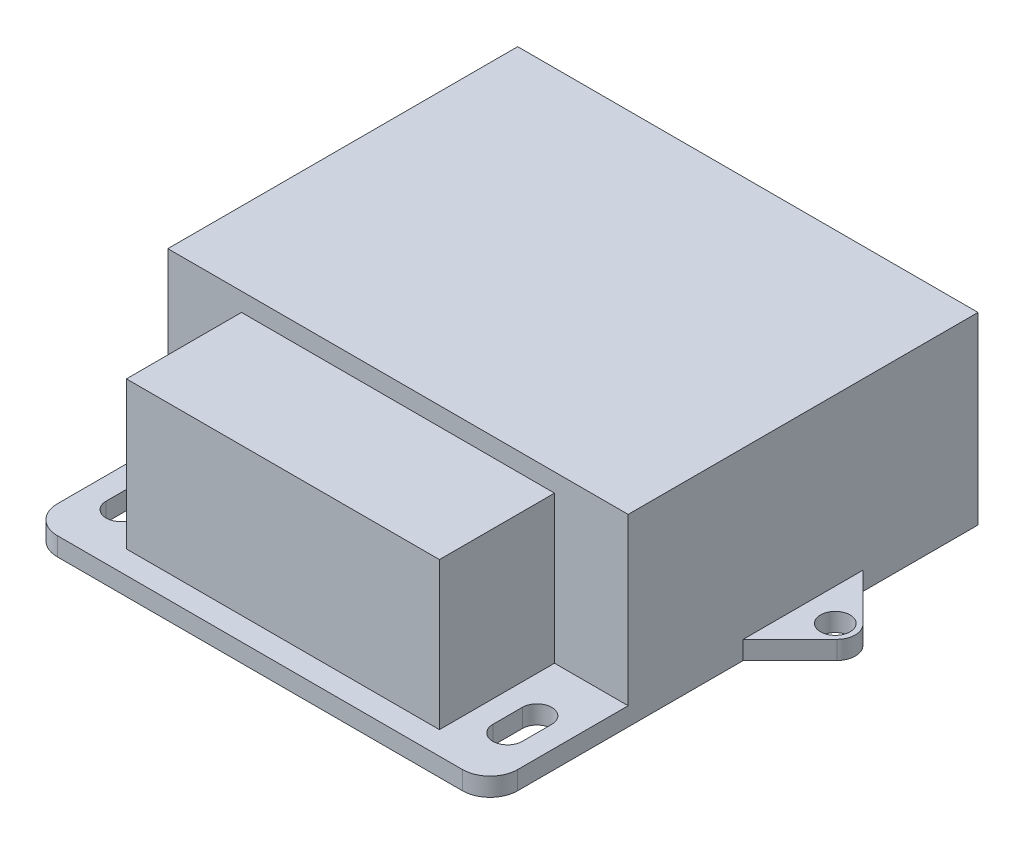
ISO-10303-21;
HEADER;
FILE_DESCRIPTION(('STEP AP214'),'2;1');
FILE_NAME('part.step','',(''),(''),'','','');
FILE_SCHEMA(('AUTOMOTIVE_DESIGN { 1 0 10303 214 1 1 1 1 }'));
ENDSEC;
DATA;
#1=APPLICATION_CONTEXT('core data for automotive mechanical design processes');
#2=APPLICATION_PROTOCOL_DEFINITION('international standard','automotive_design',2000,#1);
#3=PRODUCT_CONTEXT('',#1,'mechanical');
#4=PRODUCT('Part','Part','',(#3));
#5=PRODUCT_RELATED_PRODUCT_CATEGORY('part','',(#4));
#6=PRODUCT_DEFINITION_FORMATION('','',#4);
#7=PRODUCT_DEFINITION_CONTEXT('part definition',#1,'design');
#8=PRODUCT_DEFINITION('design','',#6,#7);
#9=PRODUCT_DEFINITION_SHAPE('','',#8);
#10=(LENGTH_UNIT() NAMED_UNIT(*) SI_UNIT(.MILLI.,.METRE.));
#11=(NAMED_UNIT(*) PLANE_ANGLE_UNIT() SI_UNIT($,.RADIAN.));
#12=(NAMED_UNIT(*) SI_UNIT($,.STERADIAN.) SOLID_ANGLE_UNIT());
#13=UNCERTAINTY_MEASURE_WITH_UNIT(LENGTH_MEASURE(1.E-05),#10,'distance_accuracy_value','');
#14=(GEOMETRIC_REPRESENTATION_CONTEXT(3) GLOBAL_UNCERTAINTY_ASSIGNED_CONTEXT((#13)) GLOBAL_UNIT_ASSIGNED_CONTEXT((#10,
#11,#12)) REPRESENTATION_CONTEXT('',''));
#15=CARTESIAN_POINT('',(0.,0.,0.));
#16=DIRECTION('',(0.,0.,1.));
#17=DIRECTION('',(1.,0.,0.));
#18=AXIS2_PLACEMENT_3D('',#15,#16,#17);
#19=CARTESIAN_POINT('',(25.,2.,-26.5));
#20=DIRECTION('',(-1.,0.,0.));
#21=DIRECTION('',(0.,0.,1.));
#22=AXIS2_PLACEMENT_3D('',#19,#20,#21);
#23=PLANE('',#22);
#24=DIRECTION('',(0.,1.,0.));
#25=VECTOR('',#24,1.);
#26=CARTESIAN_POINT('',(25.,0.,-1.00000000000017));
#27=LINE('',#26,#25);
#28=CARTESIAN_POINT('',(25.,0.,-1.00000000000018));
#29=VERTEX_POINT('',#28);
#30=CARTESIAN_POINT('',(25.,2.,-1.00000000000017));
#31=VERTEX_POINT('',#30);
#32=EDGE_CURVE('E222',#29,#31,#27,.T.);
#33=ORIENTED_EDGE('',*,*,#32,.T.);
#34=DIRECTION('',(0.,0.,-1.));
#35=VECTOR('',#34,1.);
#36=CARTESIAN_POINT('',(25.,2.,-1.00000000000017));
#37=LINE('',#36,#35);
#38=CARTESIAN_POINT('',(25.,2.,-14.));
#39=VERTEX_POINT('',#38);
#40=EDGE_CURVE('E216',#31,#39,#37,.T.);
#41=ORIENTED_EDGE('',*,*,#40,.T.);
#42=DIRECTION('',(0.,1.,0.));
#43=VECTOR('',#42,1.);
#44=CARTESIAN_POINT('',(25.,0.,-14.));
#45=LINE('',#44,#43);
#46=CARTESIAN_POINT('',(25.,0.,-14.));
#47=VERTEX_POINT('',#46);
#48=EDGE_CURVE('E218',#47,#39,#45,.T.);
#49=ORIENTED_EDGE('',*,*,#48,.F.);
#50=DIRECTION('',(0.,0.,-1.));
#51=VECTOR('',#50,1.);
#52=CARTESIAN_POINT('',(25.,0.,-26.5));
#53=LINE('',#52,#51);
#54=CARTESIAN_POINT('',(25.,0.,-26.5));
#55=VERTEX_POINT('',#54);
#56=EDGE_CURVE('E382',#47,#55,#53,.T.);
#57=ORIENTED_EDGE('',*,*,#56,.T.);
#58=DIRECTION('',(0.,-1.,0.));
#59=VECTOR('',#58,1.);
#60=CARTESIAN_POINT('',(25.,2.,-26.5));
#61=LINE('',#60,#59);
#62=CARTESIAN_POINT('',(25.,20.,-26.5));
#63=VERTEX_POINT('',#62);
#64=EDGE_CURVE('E405',#63,#55,#61,.T.);
#65=ORIENTED_EDGE('',*,*,#64,.F.);
#66=DIRECTION('',(0.,0.,-1.));
#67=VECTOR('',#66,1.);
#68=CARTESIAN_POINT('',(25.,20.,-26.5));
#69=LINE('',#68,#67);
#70=CARTESIAN_POINT('',(25.,20.,11.5));
#71=VERTEX_POINT('',#70);
#72=EDGE_CURVE('E301',#71,#63,#69,.T.);
#73=ORIENTED_EDGE('',*,*,#72,.F.);
#74=DIRECTION('',(0.,-1.,0.));
#75=VECTOR('',#74,1.);
#76=CARTESIAN_POINT('',(25.,20.,11.5));
#77=LINE('',#76,#75);
#78=CARTESIAN_POINT('',(25.,2.,11.5));
#79=VERTEX_POINT('',#78);
#80=EDGE_CURVE('E312',#71,#79,#77,.T.);
#81=ORIENTED_EDGE('',*,*,#80,.T.);
#82=DIRECTION('',(0.,0.,-1.));
#83=VECTOR('',#82,1.);
#84=CARTESIAN_POINT('',(25.,2.,-26.5));
#85=LINE('',#84,#83);
#86=CARTESIAN_POINT('',(25.,2.,23.5));
#87=VERTEX_POINT('',#86);
#88=EDGE_CURVE('E383',#87,#79,#85,.T.);
#89=ORIENTED_EDGE('',*,*,#88,.F.);
#90=DIRECTION('',(0.,-1.,0.));
#91=VECTOR('',#90,1.);
#92=CARTESIAN_POINT('',(25.,2.,23.5));
#93=LINE('',#92,#91);
#94=CARTESIAN_POINT('',(25.,0.,23.5));
#95=VERTEX_POINT('',#94);
#96=EDGE_CURVE('E425',#87,#95,#93,.T.);
#97=ORIENTED_EDGE('',*,*,#96,.T.);
#98=EDGE_CURVE('E393',#95,#29,#53,.T.);
#99=ORIENTED_EDGE('',*,*,#98,.T.);
#100=EDGE_LOOP('',(#33,#41,#49,#57,#65,#73,#81,#89,#97,#99));
#101=FACE_BOUND('',#100,.T.);
#102=ADVANCED_FACE('F33',(#101),#23,.F.);
#103=CARTESIAN_POINT('',(0.,2.,0.));
#104=DIRECTION('',(0.,1.,0.));
#105=DIRECTION('',(0.,0.,1.));
#106=AXIS2_PLACEMENT_3D('',#103,#104,#105);
#107=PLANE('',#106);
#108=DIRECTION('',(0.,0.,1.));
#109=VECTOR('',#108,1.);
#110=CARTESIAN_POINT('',(19.4,2.,17.4));
#111=LINE('',#110,#109);
#112=CARTESIAN_POINT('',(19.4,2.,17.4));
#113=VERTEX_POINT('',#112);
#114=CARTESIAN_POINT('',(19.4,2.,20.6));
#115=VERTEX_POINT('',#114);
#116=EDGE_CURVE('E354',#113,#115,#111,.T.);
#117=ORIENTED_EDGE('',*,*,#116,.F.);
#118=CARTESIAN_POINT('',(21.,2.,17.4));
#119=DIRECTION('',(0.,1.,0.));
#120=DIRECTION('',(0.,0.,1.));
#121=AXIS2_PLACEMENT_3D('',#118,#119,#120);
#122=CIRCLE('',#121,1.6);
#123=CARTESIAN_POINT('',(22.6,2.,17.4));
#124=VERTEX_POINT('',#123);
#125=EDGE_CURVE('E352',#124,#113,#122,.T.);
#126=ORIENTED_EDGE('',*,*,#125,.F.);
#127=DIRECTION('',(0.,0.,-1.));
#128=VECTOR('',#127,1.);
#129=CARTESIAN_POINT('',(22.6,2.,17.4));
#130=LINE('',#129,#128);
#131=CARTESIAN_POINT('',(22.6,2.,20.6));
#132=VERTEX_POINT('',#131);
#133=EDGE_CURVE('E360',#132,#124,#130,.T.);
#134=ORIENTED_EDGE('',*,*,#133,.F.);
#135=CARTESIAN_POINT('',(21.,2.,20.6));
#136=DIRECTION('',(0.,1.,0.));
#137=DIRECTION('',(0.,0.,1.));
#138=AXIS2_PLACEMENT_3D('',#135,#136,#137);
#139=CIRCLE('',#138,1.6);
#140=EDGE_CURVE('E357',#115,#132,#139,.T.);
#141=ORIENTED_EDGE('',*,*,#140,.F.);
#142=EDGE_LOOP('',(#117,#126,#134,#141));
#143=FACE_BOUND('',#142,.T.);
#144=DIRECTION('',(0.,0.,1.));
#145=VECTOR('',#144,1.);
#146=CARTESIAN_POINT('',(-22.6,2.,17.4000000000001));
#147=LINE('',#146,#145);
#148=CARTESIAN_POINT('',(-22.6,2.,17.4000000000001));
#149=VERTEX_POINT('',#148);
#150=CARTESIAN_POINT('',(-22.6,2.,20.6000000000001));
#151=VERTEX_POINT('',#150);
#152=EDGE_CURVE('E323',#149,#151,#147,.T.);
#153=ORIENTED_EDGE('',*,*,#152,.F.);
#154=CARTESIAN_POINT('',(-21.,2.,17.4000000000001));
#155=DIRECTION('',(0.,1.,0.));
#156=DIRECTION('',(0.,0.,-1.));
#157=AXIS2_PLACEMENT_3D('',#154,#155,#156);
#158=CIRCLE('',#157,1.6);
#159=CARTESIAN_POINT('',(-19.4,2.,17.4000000000001));
#160=VERTEX_POINT('',#159);
#161=EDGE_CURVE('E321',#160,#149,#158,.T.);
#162=ORIENTED_EDGE('',*,*,#161,.F.);
#163=DIRECTION('',(0.,0.,-1.));
#164=VECTOR('',#163,1.);
#165=CARTESIAN_POINT('',(-19.4,2.,17.4000000000001));
#166=LINE('',#165,#164);
#167=CARTESIAN_POINT('',(-19.4,2.,20.6000000000001));
#168=VERTEX_POINT('',#167);
#169=EDGE_CURVE('E329',#168,#160,#166,.T.);
#170=ORIENTED_EDGE('',*,*,#169,.F.);
#171=CARTESIAN_POINT('',(-21.,2.,20.6000000000001));
#172=DIRECTION('',(0.,1.,0.));
#173=DIRECTION('',(0.,0.,-1.));
#174=AXIS2_PLACEMENT_3D('',#171,#172,#173);
#175=CIRCLE('',#174,1.6);
#176=EDGE_CURVE('E326',#151,#168,#175,.T.);
#177=ORIENTED_EDGE('',*,*,#176,.F.);
#178=EDGE_LOOP('',(#153,#162,#170,#177));
#179=FACE_BOUND('',#178,.T.);
#180=DIRECTION('',(1.,0.,0.));
#181=VECTOR('',#180,1.);
#182=CARTESIAN_POINT('',(25.,2.,11.5));
#183=LINE('',#182,#181);
#184=CARTESIAN_POINT('',(17.,2.,11.5));
#185=VERTEX_POINT('',#184);
#186=EDGE_CURVE('E300',#185,#79,#183,.T.);
#187=ORIENTED_EDGE('',*,*,#186,.F.);
#188=DIRECTION('',(0.,0.,-1.));
#189=VECTOR('',#188,1.);
#190=CARTESIAN_POINT('',(17.,2.,11.5));
#191=LINE('',#190,#189);
#192=CARTESIAN_POINT('',(17.,2.,24.));
#193=VERTEX_POINT('',#192);
#194=EDGE_CURVE('E268',#193,#185,#191,.T.);
#195=ORIENTED_EDGE('',*,*,#194,.F.);
#196=DIRECTION('',(1.,0.,0.));
#197=VECTOR('',#196,1.);
#198=CARTESIAN_POINT('',(17.,2.,24.));
#199=LINE('',#198,#197);
#200=CARTESIAN_POINT('',(-17.,2.,24.));
#201=VERTEX_POINT('',#200);
#202=EDGE_CURVE('E275',#201,#193,#199,.T.);
#203=ORIENTED_EDGE('',*,*,#202,.F.);
#204=DIRECTION('',(0.,0.,1.));
#205=VECTOR('',#204,1.);
#206=CARTESIAN_POINT('',(-17.,2.,11.5));
#207=LINE('',#206,#205);
#208=CARTESIAN_POINT('',(-17.,2.,11.5));
#209=VERTEX_POINT('',#208);
#210=EDGE_CURVE('E285',#209,#201,#207,.T.);
#211=ORIENTED_EDGE('',*,*,#210,.F.);
#212=CARTESIAN_POINT('',(-25.,2.,11.5));
#213=VERTEX_POINT('',#212);
#214=EDGE_CURVE('E305',#213,#209,#183,.T.);
#215=ORIENTED_EDGE('',*,*,#214,.F.);
#216=DIRECTION('',(0.,0.,1.));
#217=VECTOR('',#216,1.);
#218=CARTESIAN_POINT('',(-25.,2.,-26.5));
#219=LINE('',#218,#217);
#220=CARTESIAN_POINT('',(-25.,2.,23.5));
#221=VERTEX_POINT('',#220);
#222=EDGE_CURVE('E386',#213,#221,#219,.T.);
#223=ORIENTED_EDGE('',*,*,#222,.T.);
#224=CARTESIAN_POINT('',(-22.,2.,23.5));
#225=DIRECTION('',(0.,1.,0.));
#226=DIRECTION('',(0.,0.,1.));
#227=AXIS2_PLACEMENT_3D('',#224,#225,#226);
#228=CIRCLE('',#227,3.);
#229=CARTESIAN_POINT('',(-22.,2.,26.5));
#230=VERTEX_POINT('',#229);
#231=EDGE_CURVE('E423',#221,#230,#228,.T.);
#232=ORIENTED_EDGE('',*,*,#231,.T.);
#233=DIRECTION('',(1.,0.,0.));
#234=VECTOR('',#233,1.);
#235=CARTESIAN_POINT('',(-25.,2.,26.5));
#236=LINE('',#235,#234);
#237=CARTESIAN_POINT('',(22.,2.,26.5));
#238=VERTEX_POINT('',#237);
#239=EDGE_CURVE('E389',#230,#238,#236,.T.);
#240=ORIENTED_EDGE('',*,*,#239,.T.);
#241=CARTESIAN_POINT('',(22.,2.,23.5));
#242=DIRECTION('',(0.,1.,0.));
#243=DIRECTION('',(0.,0.,1.));
#244=AXIS2_PLACEMENT_3D('',#241,#242,#243);
#245=CIRCLE('',#244,3.);
#246=EDGE_CURVE('E421',#238,#87,#245,.T.);
#247=ORIENTED_EDGE('',*,*,#246,.T.);
#248=ORIENTED_EDGE('',*,*,#88,.T.);
#249=EDGE_LOOP('',(#187,#195,#203,#211,#215,#223,#232,#240,#247,#248));
#250=FACE_BOUND('',#249,.T.);
#251=ADVANCED_FACE('F470',(#143,#179,#250),#107,.T.);
#252=CARTESIAN_POINT('',(25.,20.,11.5));
#253=DIRECTION('',(0.,0.,-1.));
#254=DIRECTION('',(-1.,0.,0.));
#255=AXIS2_PLACEMENT_3D('',#252,#253,#254);
#256=PLANE('',#255);
#257=DIRECTION('',(0.,-1.,0.));
#258=VECTOR('',#257,1.);
#259=CARTESIAN_POINT('',(17.,18.,11.5));
#260=LINE('',#259,#258);
#261=CARTESIAN_POINT('',(17.,18.,11.5));
#262=VERTEX_POINT('',#261);
#263=EDGE_CURVE('E298',#262,#185,#260,.T.);
#264=ORIENTED_EDGE('',*,*,#263,.T.);
#265=ORIENTED_EDGE('',*,*,#186,.T.);
#266=ORIENTED_EDGE('',*,*,#80,.F.);
#267=DIRECTION('',(1.,0.,0.));
#268=VECTOR('',#267,1.);
#269=CARTESIAN_POINT('',(25.,20.,11.5));
#270=LINE('',#269,#268);
#271=CARTESIAN_POINT('',(-25.,20.,11.5));
#272=VERTEX_POINT('',#271);
#273=EDGE_CURVE('E310',#272,#71,#270,.T.);
#274=ORIENTED_EDGE('',*,*,#273,.F.);
#275=DIRECTION('',(0.,-1.,0.));
#276=VECTOR('',#275,1.);
#277=CARTESIAN_POINT('',(-25.,20.,11.5));
#278=LINE('',#277,#276);
#279=EDGE_CURVE('E317',#272,#213,#278,.T.);
#280=ORIENTED_EDGE('',*,*,#279,.T.);
#281=ORIENTED_EDGE('',*,*,#214,.T.);
#282=DIRECTION('',(0.,-1.,0.));
#283=VECTOR('',#282,1.);
#284=CARTESIAN_POINT('',(-17.,18.,11.5));
#285=LINE('',#284,#283);
#286=CARTESIAN_POINT('',(-17.,18.,11.5));
#287=VERTEX_POINT('',#286);
#288=EDGE_CURVE('E295',#287,#209,#285,.T.);
#289=ORIENTED_EDGE('',*,*,#288,.F.);
#290=DIRECTION('',(-1.,0.,0.));
#291=VECTOR('',#290,1.);
#292=CARTESIAN_POINT('',(17.,18.,11.5));
#293=LINE('',#292,#291);
#294=EDGE_CURVE('E274',#262,#287,#293,.T.);
#295=ORIENTED_EDGE('',*,*,#294,.F.);
#296=EDGE_LOOP('',(#264,#265,#266,#274,#280,#281,#289,#295));
#297=FACE_BOUND('',#296,.T.);
#298=ADVANCED_FACE('F475',(#297),#256,.F.);
#299=CARTESIAN_POINT('',(0.,0.,0.));
#300=DIRECTION('',(0.,1.,0.));
#301=DIRECTION('',(0.,0.,1.));
#302=AXIS2_PLACEMENT_3D('',#299,#300,#301);
#303=PLANE('',#302);
#304=CARTESIAN_POINT('',(21.,0.,17.4));
#305=DIRECTION('',(0.,1.,0.));
#306=DIRECTION('',(0.,0.,1.));
#307=AXIS2_PLACEMENT_3D('',#304,#305,#306);
#308=CIRCLE('',#307,1.6);
#309=CARTESIAN_POINT('',(22.6,0.,17.4));
#310=VERTEX_POINT('',#309);
#311=CARTESIAN_POINT('',(19.4,0.,17.4));
#312=VERTEX_POINT('',#311);
#313=EDGE_CURVE('E351',#310,#312,#308,.T.);
#314=ORIENTED_EDGE('',*,*,#313,.T.);
#315=DIRECTION('',(0.,0.,1.));
#316=VECTOR('',#315,1.);
#317=CARTESIAN_POINT('',(19.4,0.,17.4));
#318=LINE('',#317,#316);
#319=CARTESIAN_POINT('',(19.4,0.,20.6));
#320=VERTEX_POINT('',#319);
#321=EDGE_CURVE('E365',#312,#320,#318,.T.);
#322=ORIENTED_EDGE('',*,*,#321,.T.);
#323=CARTESIAN_POINT('',(21.,0.,20.6));
#324=DIRECTION('',(0.,1.,0.));
#325=DIRECTION('',(0.,0.,1.));
#326=AXIS2_PLACEMENT_3D('',#323,#324,#325);
#327=CIRCLE('',#326,1.6);
#328=CARTESIAN_POINT('',(22.6,0.,20.6));
#329=VERTEX_POINT('',#328);
#330=EDGE_CURVE('E368',#320,#329,#327,.T.);
#331=ORIENTED_EDGE('',*,*,#330,.T.);
#332=DIRECTION('',(0.,0.,-1.));
#333=VECTOR('',#332,1.);
#334=CARTESIAN_POINT('',(22.6,0.,17.4));
#335=LINE('',#334,#333);
#336=EDGE_CURVE('E355',#329,#310,#335,.T.);
#337=ORIENTED_EDGE('',*,*,#336,.T.);
#338=EDGE_LOOP('',(#314,#322,#331,#337));
#339=FACE_BOUND('',#338,.T.);
#340=DIRECTION('',(0.707106781186546,0.,0.707106781186549));
#341=VECTOR('',#340,1.);
#342=CARTESIAN_POINT('',(31.5,0.,-7.5));
#343=LINE('',#342,#341);
#344=CARTESIAN_POINT('',(30.0857864376269,0.,-8.91421356237311));
#345=VERTEX_POINT('',#344);
#346=EDGE_CURVE('E235',#47,#345,#343,.T.);
#347=ORIENTED_EDGE('',*,*,#346,.T.);
#348=CARTESIAN_POINT('',(28.6715728752538,0.,-7.50000000000002));
#349=DIRECTION('',(0.,1.,0.));
#350=DIRECTION('',(0.,0.,1.));
#351=AXIS2_PLACEMENT_3D('',#348,#349,#350);
#352=CIRCLE('',#351,2.);
#353=CARTESIAN_POINT('',(30.0857864376269,0.,-6.08578643762691));
#354=VERTEX_POINT('',#353);
#355=EDGE_CURVE('E436',#345,#354,#352,.F.);
#356=ORIENTED_EDGE('',*,*,#355,.T.);
#357=DIRECTION('',(-0.707106781186556,0.,0.707106781186539));
#358=VECTOR('',#357,1.);
#359=CARTESIAN_POINT('',(31.5,0.,-7.5));
#360=LINE('',#359,#358);
#361=EDGE_CURVE('E226',#354,#29,#360,.T.);
#362=ORIENTED_EDGE('',*,*,#361,.T.);
#363=ORIENTED_EDGE('',*,*,#98,.F.);
#364=CARTESIAN_POINT('',(22.,0.,23.5));
#365=DIRECTION('',(0.,1.,0.));
#366=DIRECTION('',(0.,0.,1.));
#367=AXIS2_PLACEMENT_3D('',#364,#365,#366);
#368=CIRCLE('',#367,3.);
#369=CARTESIAN_POINT('',(22.,0.,26.5));
#370=VERTEX_POINT('',#369);
#371=EDGE_CURVE('E413',#95,#370,#368,.F.);
#372=ORIENTED_EDGE('',*,*,#371,.T.);
#373=DIRECTION('',(1.,0.,0.));
#374=VECTOR('',#373,1.);
#375=CARTESIAN_POINT('',(-25.,0.,26.5));
#376=LINE('',#375,#374);
#377=CARTESIAN_POINT('',(-22.,0.,26.5));
#378=VERTEX_POINT('',#377);
#379=EDGE_CURVE('E387',#378,#370,#376,.T.);
#380=ORIENTED_EDGE('',*,*,#379,.F.);
#381=CARTESIAN_POINT('',(-22.,0.,23.5));
#382=DIRECTION('',(0.,1.,0.));
#383=DIRECTION('',(0.,0.,1.));
#384=AXIS2_PLACEMENT_3D('',#381,#382,#383);
#385=CIRCLE('',#384,3.);
#386=CARTESIAN_POINT('',(-25.,0.,23.5));
#387=VERTEX_POINT('',#386);
#388=EDGE_CURVE('E415',#378,#387,#385,.F.);
#389=ORIENTED_EDGE('',*,*,#388,.T.);
#390=DIRECTION('',(0.,0.,1.));
#391=VECTOR('',#390,1.);
#392=CARTESIAN_POINT('',(-25.,0.,-26.5));
#393=LINE('',#392,#391);
#394=CARTESIAN_POINT('',(-25.,0.,-1.00000000000017));
#395=VERTEX_POINT('',#394);
#396=EDGE_CURVE('E397',#395,#387,#393,.T.);
#397=ORIENTED_EDGE('',*,*,#396,.F.);
#398=DIRECTION('',(0.707106781186556,0.,0.707106781186539));
#399=VECTOR('',#398,1.);
#400=CARTESIAN_POINT('',(-31.5,0.,-7.5));
#401=LINE('',#400,#399);
#402=CARTESIAN_POINT('',(-30.0857864376269,0.,-6.08578643762691));
#403=VERTEX_POINT('',#402);
#404=EDGE_CURVE('E254',#403,#395,#401,.T.);
#405=ORIENTED_EDGE('',*,*,#404,.F.);
#406=CARTESIAN_POINT('',(-28.6715728752538,0.,-7.50000000000002));
#407=DIRECTION('',(0.,1.,0.));
#408=DIRECTION('',(0.,0.,1.));
#409=AXIS2_PLACEMENT_3D('',#406,#407,#408);
#410=CIRCLE('',#409,2.);
#411=CARTESIAN_POINT('',(-30.0857864376269,0.,-8.91421356237311));
#412=VERTEX_POINT('',#411);
#413=EDGE_CURVE('E434',#403,#412,#410,.F.);
#414=ORIENTED_EDGE('',*,*,#413,.T.);
#415=DIRECTION('',(-0.707106781186546,0.,0.707106781186549));
#416=VECTOR('',#415,1.);
#417=CARTESIAN_POINT('',(-31.5,0.,-7.5));
#418=LINE('',#417,#416);
#419=CARTESIAN_POINT('',(-25.,0.,-14.));
#420=VERTEX_POINT('',#419);
#421=EDGE_CURVE('E256',#420,#412,#418,.T.);
#422=ORIENTED_EDGE('',*,*,#421,.F.);
#423=CARTESIAN_POINT('',(-25.,0.,-26.5));
#424=VERTEX_POINT('',#423);
#425=EDGE_CURVE('E398',#424,#420,#393,.T.);
#426=ORIENTED_EDGE('',*,*,#425,.F.);
#427=DIRECTION('',(-1.,0.,0.));
#428=VECTOR('',#427,1.);
#429=CARTESIAN_POINT('',(-25.,0.,-26.5));
#430=LINE('',#429,#428);
#431=EDGE_CURVE('E395',#55,#424,#430,.T.);
#432=ORIENTED_EDGE('',*,*,#431,.F.);
#433=ORIENTED_EDGE('',*,*,#56,.F.);
#434=EDGE_LOOP('',(#347,#356,#362,#363,#372,#380,#389,#397,#405,#414,#422,#426,#432,#433));
#435=FACE_BOUND('',#434,.T.);
#436=CARTESIAN_POINT('',(-21.,0.,17.4000000000001));
#437=DIRECTION('',(0.,1.,0.));
#438=DIRECTION('',(0.,0.,-1.));
#439=AXIS2_PLACEMENT_3D('',#436,#437,#438);
#440=CIRCLE('',#439,1.6);
#441=CARTESIAN_POINT('',(-19.4,0.,17.4000000000001));
#442=VERTEX_POINT('',#441);
#443=CARTESIAN_POINT('',(-22.6,0.,17.4000000000001));
#444=VERTEX_POINT('',#443);
#445=EDGE_CURVE('E320',#442,#444,#440,.T.);
#446=ORIENTED_EDGE('',*,*,#445,.T.);
#447=DIRECTION('',(0.,0.,1.));
#448=VECTOR('',#447,1.);
#449=CARTESIAN_POINT('',(-22.6,0.,17.4000000000001));
#450=LINE('',#449,#448);
#451=CARTESIAN_POINT('',(-22.6,0.,20.6000000000001));
#452=VERTEX_POINT('',#451);
#453=EDGE_CURVE('E334',#444,#452,#450,.T.);
#454=ORIENTED_EDGE('',*,*,#453,.T.);
#455=CARTESIAN_POINT('',(-21.,0.,20.6000000000001));
#456=DIRECTION('',(0.,1.,0.));
#457=DIRECTION('',(0.,0.,-1.));
#458=AXIS2_PLACEMENT_3D('',#455,#456,#457);
#459=CIRCLE('',#458,1.6);
#460=CARTESIAN_POINT('',(-19.4,0.,20.6000000000001));
#461=VERTEX_POINT('',#460);
#462=EDGE_CURVE('E337',#452,#461,#459,.T.);
#463=ORIENTED_EDGE('',*,*,#462,.T.);
#464=DIRECTION('',(0.,0.,-1.));
#465=VECTOR('',#464,1.);
#466=CARTESIAN_POINT('',(-19.4,0.,17.4000000000001));
#467=LINE('',#466,#465);
#468=EDGE_CURVE('E324',#461,#442,#467,.T.);
#469=ORIENTED_EDGE('',*,*,#468,.T.);
#470=EDGE_LOOP('',(#446,#454,#463,#469));
#471=FACE_BOUND('',#470,.T.);
#472=CARTESIAN_POINT('',(-28.5,0.,-7.5));
#473=DIRECTION('',(0.,1.,0.));
#474=DIRECTION('',(0.,0.,1.));
#475=AXIS2_PLACEMENT_3D('',#472,#473,#474);
#476=CIRCLE('',#475,1.6);
#477=CARTESIAN_POINT('',(-28.5,0.,-5.9));
#478=VERTEX_POINT('',#477);
#479=EDGE_CURVE('E248',#478,#478,#476,.T.);
#480=ORIENTED_EDGE('',*,*,#479,.T.);
#481=EDGE_LOOP('',(#480));
#482=FACE_BOUND('',#481,.T.);
#483=CARTESIAN_POINT('',(28.5,0.,-7.5));
#484=DIRECTION('',(0.,-1.,0.));
#485=DIRECTION('',(0.,0.,1.));
#486=AXIS2_PLACEMENT_3D('',#483,#484,#485);
#487=CIRCLE('',#486,1.6);
#488=CARTESIAN_POINT('',(28.5,0.,-5.9));
#489=VERTEX_POINT('',#488);
#490=EDGE_CURVE('E242',#489,#489,#487,.T.);
#491=ORIENTED_EDGE('',*,*,#490,.F.);
#492=EDGE_LOOP('',(#491));
#493=FACE_BOUND('',#492,.T.);
#494=ADVANCED_FACE('F452',(#339,#435,#471,#482,#493),#303,.F.);
#495=CARTESIAN_POINT('',(-25.,2.,-26.5));
#496=DIRECTION('',(0.,0.,1.));
#497=DIRECTION('',(1.,0.,0.));
#498=AXIS2_PLACEMENT_3D('',#495,#496,#497);
#499=PLANE('',#498);
#500=ORIENTED_EDGE('',*,*,#431,.T.);
#501=DIRECTION('',(0.,-1.,0.));
#502=VECTOR('',#501,1.);
#503=CARTESIAN_POINT('',(-25.,2.,-26.5));
#504=LINE('',#503,#502);
#505=CARTESIAN_POINT('',(-25.,20.,-26.5));
#506=VERTEX_POINT('',#505);
#507=EDGE_CURVE('E392',#506,#424,#504,.T.);
#508=ORIENTED_EDGE('',*,*,#507,.F.);
#509=DIRECTION('',(-1.,0.,0.));
#510=VECTOR('',#509,1.);
#511=CARTESIAN_POINT('',(25.,20.,-26.5));
#512=LINE('',#511,#510);
#513=EDGE_CURVE('E304',#63,#506,#512,.T.);
#514=ORIENTED_EDGE('',*,*,#513,.F.);
#515=ORIENTED_EDGE('',*,*,#64,.T.);
#516=EDGE_LOOP('',(#500,#508,#514,#515));
#517=FACE_BOUND('',#516,.T.);
#518=ADVANCED_FACE('F480',(#517),#499,.F.);
#519=CARTESIAN_POINT('',(-25.,2.,-26.5));
#520=DIRECTION('',(1.,0.,0.));
#521=DIRECTION('',(0.,0.,-1.));
#522=AXIS2_PLACEMENT_3D('',#519,#520,#521);
#523=PLANE('',#522);
#524=DIRECTION('',(0.,0.,-1.));
#525=VECTOR('',#524,1.);
#526=CARTESIAN_POINT('',(-25.,2.,-1.00000000000017));
#527=LINE('',#526,#525);
#528=CARTESIAN_POINT('',(-25.,2.,-1.00000000000017));
#529=VERTEX_POINT('',#528);
#530=CARTESIAN_POINT('',(-25.,2.,-14.));
#531=VERTEX_POINT('',#530);
#532=EDGE_CURVE('E262',#529,#531,#527,.T.);
#533=ORIENTED_EDGE('',*,*,#532,.F.);
#534=DIRECTION('',(0.,1.,0.));
#535=VECTOR('',#534,1.);
#536=CARTESIAN_POINT('',(-25.,0.,-1.00000000000017));
#537=LINE('',#536,#535);
#538=EDGE_CURVE('E260',#395,#529,#537,.T.);
#539=ORIENTED_EDGE('',*,*,#538,.F.);
#540=ORIENTED_EDGE('',*,*,#396,.T.);
#541=DIRECTION('',(0.,-1.,0.));
#542=VECTOR('',#541,1.);
#543=CARTESIAN_POINT('',(-25.,2.,23.5));
#544=LINE('',#543,#542);
#545=EDGE_CURVE('E418',#387,#221,#544,.F.);
#546=ORIENTED_EDGE('',*,*,#545,.T.);
#547=ORIENTED_EDGE('',*,*,#222,.F.);
#548=ORIENTED_EDGE('',*,*,#279,.F.);
#549=DIRECTION('',(0.,0.,1.));
#550=VECTOR('',#549,1.);
#551=CARTESIAN_POINT('',(-25.,20.,-26.5));
#552=LINE('',#551,#550);
#553=EDGE_CURVE('E308',#506,#272,#552,.T.);
#554=ORIENTED_EDGE('',*,*,#553,.F.);
#555=ORIENTED_EDGE('',*,*,#507,.T.);
#556=ORIENTED_EDGE('',*,*,#425,.T.);
#557=DIRECTION('',(0.,1.,0.));
#558=VECTOR('',#557,1.);
#559=CARTESIAN_POINT('',(-25.,0.,-14.));
#560=LINE('',#559,#558);
#561=EDGE_CURVE('E265',#420,#531,#560,.T.);
#562=ORIENTED_EDGE('',*,*,#561,.T.);
#563=EDGE_LOOP('',(#533,#539,#540,#546,#547,#548,#554,#555,#556,#562));
#564=FACE_BOUND('',#563,.T.);
#565=ADVANCED_FACE('F448',(#564),#523,.F.);
#566=CARTESIAN_POINT('',(-25.,2.,26.5));
#567=DIRECTION('',(0.,0.,-1.));
#568=DIRECTION('',(-1.,0.,0.));
#569=AXIS2_PLACEMENT_3D('',#566,#567,#568);
#570=PLANE('',#569);
#571=ORIENTED_EDGE('',*,*,#239,.F.);
#572=DIRECTION('',(0.,-1.,0.));
#573=VECTOR('',#572,1.);
#574=CARTESIAN_POINT('',(-22.,2.,26.5));
#575=LINE('',#574,#573);
#576=EDGE_CURVE('E410',#230,#378,#575,.T.);
#577=ORIENTED_EDGE('',*,*,#576,.T.);
#578=ORIENTED_EDGE('',*,*,#379,.T.);
#579=DIRECTION('',(0.,-1.,0.));
#580=VECTOR('',#579,1.);
#581=CARTESIAN_POINT('',(22.,2.,26.5));
#582=LINE('',#581,#580);
#583=EDGE_CURVE('E408',#370,#238,#582,.F.);
#584=ORIENTED_EDGE('',*,*,#583,.T.);
#585=EDGE_LOOP('',(#571,#577,#578,#584));
#586=FACE_BOUND('',#585,.T.);
#587=ADVANCED_FACE('F528',(#586),#570,.F.);
#588=CARTESIAN_POINT('',(21.,2.,17.4));
#589=DIRECTION('',(0.,-1.,0.));
#590=DIRECTION('',(0.,0.,-1.));
#591=AXIS2_PLACEMENT_3D('',#588,#589,#590);
#592=CYLINDRICAL_SURFACE('',#591,1.6);
#593=ORIENTED_EDGE('',*,*,#313,.F.);
#594=DIRECTION('',(0.,-1.,0.));
#595=VECTOR('',#594,1.);
#596=CARTESIAN_POINT('',(22.6,2.,17.4));
#597=LINE('',#596,#595);
#598=EDGE_CURVE('E362',#124,#310,#597,.T.);
#599=ORIENTED_EDGE('',*,*,#598,.F.);
#600=ORIENTED_EDGE('',*,*,#125,.T.);
#601=DIRECTION('',(0.,-1.,0.));
#602=VECTOR('',#601,1.);
#603=CARTESIAN_POINT('',(19.4,2.,17.4));
#604=LINE('',#603,#602);
#605=EDGE_CURVE('E379',#113,#312,#604,.T.);
#606=ORIENTED_EDGE('',*,*,#605,.T.);
#607=EDGE_LOOP('',(#593,#599,#600,#606));
#608=FACE_BOUND('',#607,.T.);
#609=ADVANCED_FACE('F530',(#608),#592,.F.);
#610=CARTESIAN_POINT('',(19.4,2.,17.4));
#611=DIRECTION('',(1.,0.,0.));
#612=DIRECTION('',(0.,0.,-1.));
#613=AXIS2_PLACEMENT_3D('',#610,#611,#612);
#614=PLANE('',#613);
#615=ORIENTED_EDGE('',*,*,#321,.F.);
#616=ORIENTED_EDGE('',*,*,#605,.F.);
#617=ORIENTED_EDGE('',*,*,#116,.T.);
#618=DIRECTION('',(0.,-1.,0.));
#619=VECTOR('',#618,1.);
#620=CARTESIAN_POINT('',(19.4,2.,20.6));
#621=LINE('',#620,#619);
#622=EDGE_CURVE('E377',#115,#320,#621,.T.);
#623=ORIENTED_EDGE('',*,*,#622,.T.);
#624=EDGE_LOOP('',(#615,#616,#617,#623));
#625=FACE_BOUND('',#624,.T.);
#626=ADVANCED_FACE('F551',(#625),#614,.T.);
#627=CARTESIAN_POINT('',(21.,2.,20.6));
#628=DIRECTION('',(0.,-1.,0.));
#629=DIRECTION('',(0.,0.,-1.));
#630=AXIS2_PLACEMENT_3D('',#627,#628,#629);
#631=CYLINDRICAL_SURFACE('',#630,1.6);
#632=ORIENTED_EDGE('',*,*,#330,.F.);
#633=ORIENTED_EDGE('',*,*,#622,.F.);
#634=ORIENTED_EDGE('',*,*,#140,.T.);
#635=DIRECTION('',(0.,-1.,0.));
#636=VECTOR('',#635,1.);
#637=CARTESIAN_POINT('',(22.6,2.,20.6));
#638=LINE('',#637,#636);
#639=EDGE_CURVE('E375',#132,#329,#638,.T.);
#640=ORIENTED_EDGE('',*,*,#639,.T.);
#641=EDGE_LOOP('',(#632,#633,#634,#640));
#642=FACE_BOUND('',#641,.T.);
#643=ADVANCED_FACE('F558',(#642),#631,.F.);
#644=CARTESIAN_POINT('',(22.6,2.,17.4));
#645=DIRECTION('',(-1.,0.,0.));
#646=DIRECTION('',(0.,0.,1.));
#647=AXIS2_PLACEMENT_3D('',#644,#645,#646);
#648=PLANE('',#647);
#649=ORIENTED_EDGE('',*,*,#336,.F.);
#650=ORIENTED_EDGE('',*,*,#639,.F.);
#651=ORIENTED_EDGE('',*,*,#133,.T.);
#652=ORIENTED_EDGE('',*,*,#598,.T.);
#653=EDGE_LOOP('',(#649,#650,#651,#652));
#654=FACE_BOUND('',#653,.T.);
#655=ADVANCED_FACE('F566',(#654),#648,.T.);
#656=CARTESIAN_POINT('',(-21.,2.,17.4000000000001));
#657=DIRECTION('',(0.,-1.,0.));
#658=DIRECTION('',(0.,0.,-1.));
#659=AXIS2_PLACEMENT_3D('',#656,#657,#658);
#660=CYLINDRICAL_SURFACE('',#659,1.6);
#661=ORIENTED_EDGE('',*,*,#445,.F.);
#662=DIRECTION('',(0.,-1.,0.));
#663=VECTOR('',#662,1.);
#664=CARTESIAN_POINT('',(-19.4,2.,17.4000000000001));
#665=LINE('',#664,#663);
#666=EDGE_CURVE('E331',#160,#442,#665,.T.);
#667=ORIENTED_EDGE('',*,*,#666,.F.);
#668=ORIENTED_EDGE('',*,*,#161,.T.);
#669=DIRECTION('',(0.,-1.,0.));
#670=VECTOR('',#669,1.);
#671=CARTESIAN_POINT('',(-22.6,2.,17.4000000000001));
#672=LINE('',#671,#670);
#673=EDGE_CURVE('E348',#149,#444,#672,.T.);
#674=ORIENTED_EDGE('',*,*,#673,.T.);
#675=EDGE_LOOP('',(#661,#667,#668,#674));
#676=FACE_BOUND('',#675,.T.);
#677=ADVANCED_FACE('F574',(#676),#660,.F.);
#678=CARTESIAN_POINT('',(-22.6,2.,17.4000000000001));
#679=DIRECTION('',(1.,0.,0.));
#680=DIRECTION('',(0.,0.,-1.));
#681=AXIS2_PLACEMENT_3D('',#678,#679,#680);
#682=PLANE('',#681);
#683=ORIENTED_EDGE('',*,*,#453,.F.);
#684=ORIENTED_EDGE('',*,*,#673,.F.);
#685=ORIENTED_EDGE('',*,*,#152,.T.);
#686=DIRECTION('',(0.,-1.,0.));
#687=VECTOR('',#686,1.);
#688=CARTESIAN_POINT('',(-22.6,2.,20.6000000000001));
#689=LINE('',#688,#687);
#690=EDGE_CURVE('E346',#151,#452,#689,.T.);
#691=ORIENTED_EDGE('',*,*,#690,.T.);
#692=EDGE_LOOP('',(#683,#684,#685,#691));
#693=FACE_BOUND('',#692,.T.);
#694=ADVANCED_FACE('F582',(#693),#682,.T.);
#695=CARTESIAN_POINT('',(-21.,2.,20.6000000000001));
#696=DIRECTION('',(0.,-1.,0.));
#697=DIRECTION('',(0.,0.,-1.));
#698=AXIS2_PLACEMENT_3D('',#695,#696,#697);
#699=CYLINDRICAL_SURFACE('',#698,1.6);
#700=ORIENTED_EDGE('',*,*,#462,.F.);
#701=ORIENTED_EDGE('',*,*,#690,.F.);
#702=ORIENTED_EDGE('',*,*,#176,.T.);
#703=DIRECTION('',(0.,-1.,0.));
#704=VECTOR('',#703,1.);
#705=CARTESIAN_POINT('',(-19.4,2.,20.6000000000001));
#706=LINE('',#705,#704);
#707=EDGE_CURVE('E344',#168,#461,#706,.T.);
#708=ORIENTED_EDGE('',*,*,#707,.T.);
#709=EDGE_LOOP('',(#700,#701,#702,#708));
#710=FACE_BOUND('',#709,.T.);
#711=ADVANCED_FACE('F590',(#710),#699,.F.);
#712=CARTESIAN_POINT('',(-19.4,2.,17.4000000000001));
#713=DIRECTION('',(-1.,0.,0.));
#714=DIRECTION('',(0.,0.,1.));
#715=AXIS2_PLACEMENT_3D('',#712,#713,#714);
#716=PLANE('',#715);
#717=ORIENTED_EDGE('',*,*,#468,.F.);
#718=ORIENTED_EDGE('',*,*,#707,.F.);
#719=ORIENTED_EDGE('',*,*,#169,.T.);
#720=ORIENTED_EDGE('',*,*,#666,.T.);
#721=EDGE_LOOP('',(#717,#718,#719,#720));
#722=FACE_BOUND('',#721,.T.);
#723=ADVANCED_FACE('F486',(#722),#716,.T.);
#724=CARTESIAN_POINT('',(-22.,2.,23.5));
#725=DIRECTION('',(0.,-1.,0.));
#726=DIRECTION('',(0.,0.,-1.));
#727=AXIS2_PLACEMENT_3D('',#724,#725,#726);
#728=CYLINDRICAL_SURFACE('',#727,3.);
#729=ORIENTED_EDGE('',*,*,#231,.F.);
#730=ORIENTED_EDGE('',*,*,#545,.F.);
#731=ORIENTED_EDGE('',*,*,#388,.F.);
#732=ORIENTED_EDGE('',*,*,#576,.F.);
#733=EDGE_LOOP('',(#729,#730,#731,#732));
#734=FACE_BOUND('',#733,.T.);
#735=ADVANCED_FACE('F482',(#734),#728,.T.);
#736=CARTESIAN_POINT('',(22.,2.,23.5));
#737=DIRECTION('',(0.,-1.,0.));
#738=DIRECTION('',(0.,0.,-1.));
#739=AXIS2_PLACEMENT_3D('',#736,#737,#738);
#740=CYLINDRICAL_SURFACE('',#739,3.);
#741=ORIENTED_EDGE('',*,*,#246,.F.);
#742=ORIENTED_EDGE('',*,*,#583,.F.);
#743=ORIENTED_EDGE('',*,*,#371,.F.);
#744=ORIENTED_EDGE('',*,*,#96,.F.);
#745=EDGE_LOOP('',(#741,#742,#743,#744));
#746=FACE_BOUND('',#745,.T.);
#747=ADVANCED_FACE('F485',(#746),#740,.T.);
#748=CARTESIAN_POINT('',(0.,20.,0.));
#749=DIRECTION('',(0.,-1.,0.));
#750=DIRECTION('',(0.,0.,-1.));
#751=AXIS2_PLACEMENT_3D('',#748,#749,#750);
#752=PLANE('',#751);
#753=ORIENTED_EDGE('',*,*,#72,.T.);
#754=ORIENTED_EDGE('',*,*,#513,.T.);
#755=ORIENTED_EDGE('',*,*,#553,.T.);
#756=ORIENTED_EDGE('',*,*,#273,.T.);
#757=EDGE_LOOP('',(#753,#754,#755,#756));
#758=FACE_BOUND('',#757,.T.);
#759=ADVANCED_FACE('F489',(#758),#752,.F.);
#760=CARTESIAN_POINT('',(17.,18.,11.5));
#761=DIRECTION('',(-1.,0.,0.));
#762=DIRECTION('',(0.,0.,1.));
#763=AXIS2_PLACEMENT_3D('',#760,#761,#762);
#764=PLANE('',#763);
#765=ORIENTED_EDGE('',*,*,#194,.T.);
#766=ORIENTED_EDGE('',*,*,#263,.F.);
#767=DIRECTION('',(0.,0.,-1.));
#768=VECTOR('',#767,1.);
#769=CARTESIAN_POINT('',(17.,18.,11.5));
#770=LINE('',#769,#768);
#771=CARTESIAN_POINT('',(17.,18.,24.));
#772=VERTEX_POINT('',#771);
#773=EDGE_CURVE('E271',#772,#262,#770,.T.);
#774=ORIENTED_EDGE('',*,*,#773,.F.);
#775=DIRECTION('',(0.,-1.,0.));
#776=VECTOR('',#775,1.);
#777=CARTESIAN_POINT('',(17.,18.,24.));
#778=LINE('',#777,#776);
#779=EDGE_CURVE('E282',#772,#193,#778,.T.);
#780=ORIENTED_EDGE('',*,*,#779,.T.);
#781=EDGE_LOOP('',(#765,#766,#774,#780));
#782=FACE_BOUND('',#781,.T.);
#783=ADVANCED_FACE('F618',(#782),#764,.F.);
#784=CARTESIAN_POINT('',(-17.,18.,11.5));
#785=DIRECTION('',(1.,0.,0.));
#786=DIRECTION('',(0.,0.,-1.));
#787=AXIS2_PLACEMENT_3D('',#784,#785,#786);
#788=PLANE('',#787);
#789=ORIENTED_EDGE('',*,*,#210,.T.);
#790=DIRECTION('',(0.,-1.,0.));
#791=VECTOR('',#790,1.);
#792=CARTESIAN_POINT('',(-17.,18.,24.));
#793=LINE('',#792,#791);
#794=CARTESIAN_POINT('',(-17.,18.,24.));
#795=VERTEX_POINT('',#794);
#796=EDGE_CURVE('E292',#795,#201,#793,.T.);
#797=ORIENTED_EDGE('',*,*,#796,.F.);
#798=DIRECTION('',(0.,0.,1.));
#799=VECTOR('',#798,1.);
#800=CARTESIAN_POINT('',(-17.,18.,11.5));
#801=LINE('',#800,#799);
#802=EDGE_CURVE('E278',#287,#795,#801,.T.);
#803=ORIENTED_EDGE('',*,*,#802,.F.);
#804=ORIENTED_EDGE('',*,*,#288,.T.);
#805=EDGE_LOOP('',(#789,#797,#803,#804));
#806=FACE_BOUND('',#805,.T.);
#807=ADVANCED_FACE('F627',(#806),#788,.F.);
#808=CARTESIAN_POINT('',(17.,18.,24.));
#809=DIRECTION('',(0.,0.,-1.));
#810=DIRECTION('',(-1.,0.,0.));
#811=AXIS2_PLACEMENT_3D('',#808,#809,#810);
#812=PLANE('',#811);
#813=ORIENTED_EDGE('',*,*,#202,.T.);
#814=ORIENTED_EDGE('',*,*,#779,.F.);
#815=DIRECTION('',(1.,0.,0.));
#816=VECTOR('',#815,1.);
#817=CARTESIAN_POINT('',(17.,18.,24.));
#818=LINE('',#817,#816);
#819=EDGE_CURVE('E280',#795,#772,#818,.T.);
#820=ORIENTED_EDGE('',*,*,#819,.F.);
#821=ORIENTED_EDGE('',*,*,#796,.T.);
#822=EDGE_LOOP('',(#813,#814,#820,#821));
#823=FACE_BOUND('',#822,.T.);
#824=ADVANCED_FACE('F466',(#823),#812,.F.);
#825=CARTESIAN_POINT('',(0.,18.,0.));
#826=DIRECTION('',(0.,-1.,0.));
#827=DIRECTION('',(0.,0.,-1.));
#828=AXIS2_PLACEMENT_3D('',#825,#826,#827);
#829=PLANE('',#828);
#830=ORIENTED_EDGE('',*,*,#773,.T.);
#831=ORIENTED_EDGE('',*,*,#294,.T.);
#832=ORIENTED_EDGE('',*,*,#802,.T.);
#833=ORIENTED_EDGE('',*,*,#819,.T.);
#834=EDGE_LOOP('',(#830,#831,#832,#833));
#835=FACE_BOUND('',#834,.T.);
#836=ADVANCED_FACE('F459',(#835),#829,.F.);
#837=CARTESIAN_POINT('',(-31.5,0.,-7.5));
#838=DIRECTION('',(-0.707106781186539,0.,0.707106781186557));
#839=DIRECTION('',(0.707106781186557,0.,0.707106781186539));
#840=AXIS2_PLACEMENT_3D('',#837,#838,#839);
#841=PLANE('',#840);
#842=DIRECTION('',(0.707106781186556,0.,0.707106781186539));
#843=VECTOR('',#842,1.);
#844=CARTESIAN_POINT('',(-31.5,2.,-7.5));
#845=LINE('',#844,#843);
#846=CARTESIAN_POINT('',(-30.0857864376269,2.,-6.08578643762691));
#847=VERTEX_POINT('',#846);
#848=EDGE_CURVE('E251',#847,#529,#845,.T.);
#849=ORIENTED_EDGE('',*,*,#848,.F.);
#850=DIRECTION('',(0.,1.,0.));
#851=VECTOR('',#850,1.);
#852=CARTESIAN_POINT('',(-30.0857864376269,0.,-6.08578643762691));
#853=LINE('',#852,#851);
#854=EDGE_CURVE('E11',#847,#403,#853,.F.);
#855=ORIENTED_EDGE('',*,*,#854,.T.);
#856=ORIENTED_EDGE('',*,*,#404,.T.);
#857=ORIENTED_EDGE('',*,*,#538,.T.);
#858=EDGE_LOOP('',(#849,#855,#856,#857));
#859=FACE_BOUND('',#858,.T.);
#860=ADVANCED_FACE('F457',(#859),#841,.T.);
#861=CARTESIAN_POINT('',(-31.5,0.,-7.5));
#862=DIRECTION('',(-0.707106781186549,0.,-0.707106781186546));
#863=DIRECTION('',(-0.707106781186546,0.,0.707106781186549));
#864=AXIS2_PLACEMENT_3D('',#861,#862,#863);
#865=PLANE('',#864);
#866=ORIENTED_EDGE('',*,*,#421,.T.);
#867=DIRECTION('',(0.,1.,0.));
#868=VECTOR('',#867,1.);
#869=CARTESIAN_POINT('',(-30.0857864376269,0.,-8.91421356237311));
#870=LINE('',#869,#868);
#871=CARTESIAN_POINT('',(-30.0857864376269,2.,-8.91421356237311));
#872=VERTEX_POINT('',#871);
#873=EDGE_CURVE('E438',#412,#872,#870,.T.);
#874=ORIENTED_EDGE('',*,*,#873,.T.);
#875=DIRECTION('',(-0.707106781186546,0.,0.707106781186549));
#876=VECTOR('',#875,1.);
#877=CARTESIAN_POINT('',(-31.5,2.,-7.5));
#878=LINE('',#877,#876);
#879=EDGE_CURVE('E257',#531,#872,#878,.T.);
#880=ORIENTED_EDGE('',*,*,#879,.F.);
#881=ORIENTED_EDGE('',*,*,#561,.F.);
#882=EDGE_LOOP('',(#866,#874,#880,#881));
#883=FACE_BOUND('',#882,.T.);
#884=ADVANCED_FACE('F441',(#883),#865,.T.);
#885=CARTESIAN_POINT('',(0.,2.,0.));
#886=DIRECTION('',(0.,1.,0.));
#887=DIRECTION('',(0.,0.,1.));
#888=AXIS2_PLACEMENT_3D('',#885,#886,#887);
#889=PLANE('',#888);
#890=CARTESIAN_POINT('',(-28.5,2.,-7.5));
#891=DIRECTION('',(0.,1.,0.));
#892=DIRECTION('',(0.,0.,1.));
#893=AXIS2_PLACEMENT_3D('',#890,#891,#892);
#894=CIRCLE('',#893,1.6);
#895=CARTESIAN_POINT('',(-28.5,2.,-5.9));
#896=VERTEX_POINT('',#895);
#897=EDGE_CURVE('E246',#896,#896,#894,.T.);
#898=ORIENTED_EDGE('',*,*,#897,.F.);
#899=EDGE_LOOP('',(#898));
#900=FACE_BOUND('',#899,.T.);
#901=ORIENTED_EDGE('',*,*,#879,.T.);
#902=CARTESIAN_POINT('',(-28.6715728752538,2.,-7.50000000000002));
#903=DIRECTION('',(0.,1.,0.));
#904=DIRECTION('',(0.,0.,1.));
#905=AXIS2_PLACEMENT_3D('',#902,#903,#904);
#906=CIRCLE('',#905,2.);
#907=EDGE_CURVE('E41',#872,#847,#906,.T.);
#908=ORIENTED_EDGE('',*,*,#907,.T.);
#909=ORIENTED_EDGE('',*,*,#848,.T.);
#910=ORIENTED_EDGE('',*,*,#532,.T.);
#911=EDGE_LOOP('',(#901,#908,#909,#910));
#912=FACE_BOUND('',#911,.T.);
#913=ADVANCED_FACE('F444',(#900,#912),#889,.T.);
#914=CARTESIAN_POINT('',(-28.5,0.,-7.5));
#915=DIRECTION('',(0.,1.,0.));
#916=DIRECTION('',(0.,0.,1.));
#917=AXIS2_PLACEMENT_3D('',#914,#915,#916);
#918=CYLINDRICAL_SURFACE('',#917,1.6);
#919=ORIENTED_EDGE('',*,*,#479,.F.);
#920=EDGE_LOOP('',(#919));
#921=FACE_BOUND('',#920,.T.);
#922=ORIENTED_EDGE('',*,*,#897,.T.);
#923=EDGE_LOOP('',(#922));
#924=FACE_BOUND('',#923,.T.);
#925=ADVANCED_FACE('F680',(#921,#924),#918,.F.);
#926=CARTESIAN_POINT('',(0.,2.,0.));
#927=DIRECTION('',(0.,1.,0.));
#928=DIRECTION('',(0.,0.,1.));
#929=AXIS2_PLACEMENT_3D('',#926,#927,#928);
#930=PLANE('',#929);
#931=DIRECTION('',(-0.707106781186556,0.,0.707106781186539));
#932=VECTOR('',#931,1.);
#933=CARTESIAN_POINT('',(31.5,2.,-7.5));
#934=LINE('',#933,#932);
#935=CARTESIAN_POINT('',(30.0857864376269,2.,-6.08578643762691));
#936=VERTEX_POINT('',#935);
#937=EDGE_CURVE('E240',#936,#31,#934,.T.);
#938=ORIENTED_EDGE('',*,*,#937,.F.);
#939=CARTESIAN_POINT('',(28.6715728752538,2.,-7.50000000000002));
#940=DIRECTION('',(0.,1.,0.));
#941=DIRECTION('',(0.,0.,1.));
#942=AXIS2_PLACEMENT_3D('',#939,#940,#941);
#943=CIRCLE('',#942,2.);
#944=CARTESIAN_POINT('',(30.0857864376269,2.,-8.91421356237311));
#945=VERTEX_POINT('',#944);
#946=EDGE_CURVE('E239',#936,#945,#943,.T.);
#947=ORIENTED_EDGE('',*,*,#946,.T.);
#948=DIRECTION('',(0.707106781186546,0.,0.707106781186549));
#949=VECTOR('',#948,1.);
#950=CARTESIAN_POINT('',(31.5,2.,-7.5));
#951=LINE('',#950,#949);
#952=EDGE_CURVE('E227',#39,#945,#951,.T.);
#953=ORIENTED_EDGE('',*,*,#952,.F.);
#954=ORIENTED_EDGE('',*,*,#40,.F.);
#955=EDGE_LOOP('',(#938,#947,#953,#954));
#956=FACE_BOUND('',#955,.T.);
#957=CARTESIAN_POINT('',(28.5,2.,-7.5));
#958=DIRECTION('',(0.,-1.,0.));
#959=DIRECTION('',(0.,0.,1.));
#960=AXIS2_PLACEMENT_3D('',#957,#958,#959);
#961=CIRCLE('',#960,1.6);
#962=CARTESIAN_POINT('',(28.5,2.,-5.9));
#963=VERTEX_POINT('',#962);
#964=EDGE_CURVE('E509',#963,#963,#961,.T.);
#965=ORIENTED_EDGE('',*,*,#964,.T.);
#966=EDGE_LOOP('',(#965));
#967=FACE_BOUND('',#966,.T.);
#968=ADVANCED_FACE('F237',(#956,#967),#930,.T.);
#969=CARTESIAN_POINT('',(31.5,0.,-7.5));
#970=DIRECTION('',(-0.707106781186539,0.,-0.707106781186557));
#971=DIRECTION('',(-0.707106781186557,0.,0.707106781186539));
#972=AXIS2_PLACEMENT_3D('',#969,#970,#971);
#973=PLANE('',#972);
#974=ORIENTED_EDGE('',*,*,#361,.F.);
#975=DIRECTION('',(0.,1.,0.));
#976=VECTOR('',#975,1.);
#977=CARTESIAN_POINT('',(30.0857864376269,0.,-6.08578643762691));
#978=LINE('',#977,#976);
#979=EDGE_CURVE('E428',#354,#936,#978,.T.);
#980=ORIENTED_EDGE('',*,*,#979,.T.);
#981=ORIENTED_EDGE('',*,*,#937,.T.);
#982=ORIENTED_EDGE('',*,*,#32,.F.);
#983=EDGE_LOOP('',(#974,#980,#981,#982));
#984=FACE_BOUND('',#983,.T.);
#985=ADVANCED_FACE('F506',(#984),#973,.F.);
#986=CARTESIAN_POINT('',(31.5,0.,-7.5));
#987=DIRECTION('',(-0.707106781186549,0.,0.707106781186546));
#988=DIRECTION('',(0.707106781186546,0.,0.707106781186549));
#989=AXIS2_PLACEMENT_3D('',#986,#987,#988);
#990=PLANE('',#989);
#991=ORIENTED_EDGE('',*,*,#952,.T.);
#992=DIRECTION('',(0.,1.,0.));
#993=VECTOR('',#992,1.);
#994=CARTESIAN_POINT('',(30.0857864376269,0.,-8.91421356237311));
#995=LINE('',#994,#993);
#996=EDGE_CURVE('E432',#945,#345,#995,.F.);
#997=ORIENTED_EDGE('',*,*,#996,.T.);
#998=ORIENTED_EDGE('',*,*,#346,.F.);
#999=ORIENTED_EDGE('',*,*,#48,.T.);
#1000=EDGE_LOOP('',(#991,#997,#998,#999));
#1001=FACE_BOUND('',#1000,.T.);
#1002=ADVANCED_FACE('F232',(#1001),#990,.F.);
#1003=CARTESIAN_POINT('',(28.5,0.,-7.5));
#1004=DIRECTION('',(0.,1.,0.));
#1005=DIRECTION('',(0.,0.,1.));
#1006=AXIS2_PLACEMENT_3D('',#1003,#1004,#1005);
#1007=CYLINDRICAL_SURFACE('',#1006,1.6);
#1008=ORIENTED_EDGE('',*,*,#490,.T.);
#1009=EDGE_LOOP('',(#1008));
#1010=FACE_BOUND('',#1009,.T.);
#1011=ORIENTED_EDGE('',*,*,#964,.F.);
#1012=EDGE_LOOP('',(#1011));
#1013=FACE_BOUND('',#1012,.T.);
#1014=ADVANCED_FACE('F493',(#1010,#1013),#1007,.F.);
#1015=CARTESIAN_POINT('',(28.6715728752538,0.,-7.50000000000002));
#1016=DIRECTION('',(0.,1.,0.));
#1017=DIRECTION('',(0.,0.,1.));
#1018=AXIS2_PLACEMENT_3D('',#1015,#1016,#1017);
#1019=CYLINDRICAL_SURFACE('',#1018,2.);
#1020=ORIENTED_EDGE('',*,*,#355,.F.);
#1021=ORIENTED_EDGE('',*,*,#996,.F.);
#1022=ORIENTED_EDGE('',*,*,#946,.F.);
#1023=ORIENTED_EDGE('',*,*,#979,.F.);
#1024=EDGE_LOOP('',(#1020,#1021,#1022,#1023));
#1025=FACE_BOUND('',#1024,.T.);
#1026=ADVANCED_FACE('F491',(#1025),#1019,.T.);
#1027=CARTESIAN_POINT('',(-28.6715728752538,0.,-7.50000000000002));
#1028=DIRECTION('',(0.,1.,0.));
#1029=DIRECTION('',(0.,0.,1.));
#1030=AXIS2_PLACEMENT_3D('',#1027,#1028,#1029);
#1031=CYLINDRICAL_SURFACE('',#1030,2.);
#1032=ORIENTED_EDGE('',*,*,#413,.F.);
#1033=ORIENTED_EDGE('',*,*,#854,.F.);
#1034=ORIENTED_EDGE('',*,*,#907,.F.);
#1035=ORIENTED_EDGE('',*,*,#873,.F.);
#1036=EDGE_LOOP('',(#1032,#1033,#1034,#1035));
#1037=FACE_BOUND('',#1036,.T.);
#1038=ADVANCED_FACE('F35',(#1037),#1031,.T.);
#1039=CLOSED_SHELL('',(#102,#251,#298,#494,#518,#565,#587,#609,#626,#643,#655,#677,#694,#711,
#723,#735,#747,#759,#783,#807,#824,#836,#860,#884,#913,#925,#968,#985,#1002,#1014,#1026,#1038));
#1040=MANIFOLD_SOLID_BREP('B2',#1039);
#1041=ADVANCED_BREP_SHAPE_REPRESENTATION('',(#18,#1040),#14);
#1042=SHAPE_DEFINITION_REPRESENTATION(#9,#1041);
ENDSEC;
END-ISO-10303-21;
